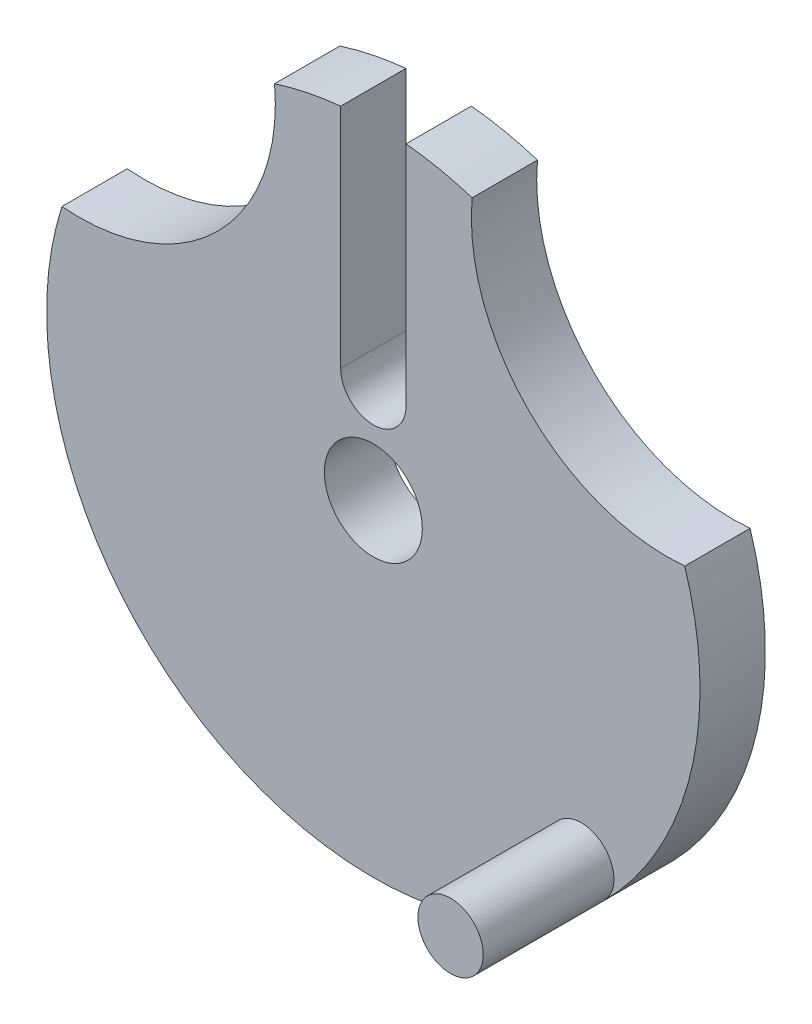
ISO-10303-21;
HEADER;
FILE_DESCRIPTION(('STEP AP214'),'2;1');
FILE_NAME('part.step','',(''),(''),'','','');
FILE_SCHEMA(('AUTOMOTIVE_DESIGN { 1 0 10303 214 1 1 1 1 }'));
ENDSEC;
DATA;
#1=APPLICATION_CONTEXT('core data for automotive mechanical design processes');
#2=APPLICATION_PROTOCOL_DEFINITION('international standard','automotive_design',2000,#1);
#3=PRODUCT_CONTEXT('',#1,'mechanical');
#4=PRODUCT('Part','Part','',(#3));
#5=PRODUCT_RELATED_PRODUCT_CATEGORY('part','',(#4));
#6=PRODUCT_DEFINITION_FORMATION('','',#4);
#7=PRODUCT_DEFINITION_CONTEXT('part definition',#1,'design');
#8=PRODUCT_DEFINITION('design','',#6,#7);
#9=PRODUCT_DEFINITION_SHAPE('','',#8);
#10=(LENGTH_UNIT() NAMED_UNIT(*) SI_UNIT(.MILLI.,.METRE.));
#11=(NAMED_UNIT(*) PLANE_ANGLE_UNIT() SI_UNIT($,.RADIAN.));
#12=(NAMED_UNIT(*) SI_UNIT($,.STERADIAN.) SOLID_ANGLE_UNIT());
#13=UNCERTAINTY_MEASURE_WITH_UNIT(LENGTH_MEASURE(1.E-05),#10,'distance_accuracy_value','');
#14=(GEOMETRIC_REPRESENTATION_CONTEXT(3) GLOBAL_UNCERTAINTY_ASSIGNED_CONTEXT((#13)) GLOBAL_UNIT_ASSIGNED_CONTEXT((#10,
#11,#12)) REPRESENTATION_CONTEXT('',''));
#15=CARTESIAN_POINT('',(0.,0.,0.));
#16=DIRECTION('',(0.,0.,1.));
#17=DIRECTION('',(1.,0.,0.));
#18=AXIS2_PLACEMENT_3D('',#15,#16,#17);
#19=CARTESIAN_POINT('',(0.,0.,5.));
#20=DIRECTION('',(0.,0.,-1.));
#21=DIRECTION('',(-1.,0.,0.));
#22=AXIS2_PLACEMENT_3D('',#19,#20,#21);
#23=CYLINDRICAL_SURFACE('',#22,25.);
#24=CARTESIAN_POINT('',(0.,0.,0.));
#25=DIRECTION('',(0.,0.,1.));
#26=DIRECTION('',(1.,0.,0.));
#27=AXIS2_PLACEMENT_3D('',#24,#25,#26);
#28=CIRCLE('',#27,25.);
#29=CARTESIAN_POINT('',(-23.8298248031153,7.55906408577356,0.));
#30=VERTEX_POINT('',#29);
#31=CARTESIAN_POINT('',(23.8298248031153,7.55906408577355,0.));
#32=VERTEX_POINT('',#31);
#33=EDGE_CURVE('E217',#30,#32,#28,.T.);
#34=ORIENTED_EDGE('',*,*,#33,.T.);
#35=DIRECTION('',(0.,0.,1.));
#36=VECTOR('',#35,1.);
#37=CARTESIAN_POINT('',(23.8298248031153,7.55906408577356,2.5));
#38=LINE('',#37,#36);
#39=CARTESIAN_POINT('',(23.8298248031153,7.55906408577356,5.));
#40=VERTEX_POINT('',#39);
#41=EDGE_CURVE('E50',#32,#40,#38,.T.);
#42=ORIENTED_EDGE('',*,*,#41,.T.);
#43=CARTESIAN_POINT('',(0.,0.,5.));
#44=DIRECTION('',(0.,0.,1.));
#45=DIRECTION('',(1.,0.,0.));
#46=AXIS2_PLACEMENT_3D('',#43,#44,#45);
#47=CIRCLE('',#46,25.);
#48=CARTESIAN_POINT('',(17.6776695296636,-17.6776695296638,5.));
#49=VERTEX_POINT('',#48);
#50=EDGE_CURVE('E43',#49,#40,#47,.T.);
#51=ORIENTED_EDGE('',*,*,#50,.F.);
#52=CARTESIAN_POINT('',(-23.8298248031153,7.55906408577356,5.));
#53=VERTEX_POINT('',#52);
#54=EDGE_CURVE('E42',#53,#49,#47,.T.);
#55=ORIENTED_EDGE('',*,*,#54,.F.);
#56=DIRECTION('',(0.,0.,1.));
#57=VECTOR('',#56,1.);
#58=CARTESIAN_POINT('',(-23.8298248031153,7.55906408577356,2.5));
#59=LINE('',#58,#57);
#60=EDGE_CURVE('E156',#53,#30,#59,.F.);
#61=ORIENTED_EDGE('',*,*,#60,.T.);
#62=EDGE_LOOP('',(#34,#42,#51,#55,#61));
#63=FACE_BOUND('',#62,.T.);
#64=ADVANCED_FACE('F33',(#63),#23,.T.);
#65=CARTESIAN_POINT('',(-2.5,24.8746859276655,0.));
#66=VERTEX_POINT('',#65);
#67=CARTESIAN_POINT('',(-7.55906408577363,23.8298248031153,0.));
#68=VERTEX_POINT('',#67);
#69=EDGE_CURVE('E37',#66,#68,#28,.T.);
#70=ORIENTED_EDGE('',*,*,#69,.T.);
#71=DIRECTION('',(0.,0.,1.));
#72=VECTOR('',#71,1.);
#73=CARTESIAN_POINT('',(-7.55906408577363,23.8298248031153,2.5));
#74=LINE('',#73,#72);
#75=CARTESIAN_POINT('',(-7.55906408577363,23.8298248031153,5.));
#76=VERTEX_POINT('',#75);
#77=EDGE_CURVE('E58',#68,#76,#74,.T.);
#78=ORIENTED_EDGE('',*,*,#77,.T.);
#79=CARTESIAN_POINT('',(-2.5,24.8746859276655,5.));
#80=VERTEX_POINT('',#79);
#81=EDGE_CURVE('E11',#80,#76,#47,.T.);
#82=ORIENTED_EDGE('',*,*,#81,.F.);
#83=DIRECTION('',(0.,0.,1.));
#84=VECTOR('',#83,1.);
#85=CARTESIAN_POINT('',(-2.5,24.8746859276655,0.));
#86=LINE('',#85,#84);
#87=EDGE_CURVE('E123',#66,#80,#86,.T.);
#88=ORIENTED_EDGE('',*,*,#87,.F.);
#89=EDGE_LOOP('',(#70,#78,#82,#88));
#90=FACE_BOUND('',#89,.T.);
#91=ADVANCED_FACE('F185',(#90),#23,.T.);
#92=CARTESIAN_POINT('',(7.55906408577363,23.8298248031153,5.));
#93=VERTEX_POINT('',#92);
#94=CARTESIAN_POINT('',(2.5,24.8746859276655,5.));
#95=VERTEX_POINT('',#94);
#96=EDGE_CURVE('E113',#93,#95,#47,.T.);
#97=ORIENTED_EDGE('',*,*,#96,.F.);
#98=DIRECTION('',(0.,0.,1.));
#99=VECTOR('',#98,1.);
#100=CARTESIAN_POINT('',(7.55906408577363,23.8298248031153,2.5));
#101=LINE('',#100,#99);
#102=CARTESIAN_POINT('',(7.55906408577363,23.8298248031153,0.));
#103=VERTEX_POINT('',#102);
#104=EDGE_CURVE('E152',#93,#103,#101,.F.);
#105=ORIENTED_EDGE('',*,*,#104,.T.);
#106=CARTESIAN_POINT('',(2.5,24.8746859276655,0.));
#107=VERTEX_POINT('',#106);
#108=EDGE_CURVE('E150',#103,#107,#28,.T.);
#109=ORIENTED_EDGE('',*,*,#108,.T.);
#110=DIRECTION('',(0.,0.,1.));
#111=VECTOR('',#110,1.);
#112=CARTESIAN_POINT('',(2.5,24.8746859276655,0.));
#113=LINE('',#112,#111);
#114=EDGE_CURVE('E119',#107,#95,#113,.T.);
#115=ORIENTED_EDGE('',*,*,#114,.T.);
#116=EDGE_LOOP('',(#97,#105,#109,#115));
#117=FACE_BOUND('',#116,.T.);
#118=ADVANCED_FACE('F35',(#117),#23,.T.);
#119=CARTESIAN_POINT('',(0.,0.,5.));
#120=DIRECTION('',(0.,0.,1.));
#121=DIRECTION('',(1.,0.,0.));
#122=AXIS2_PLACEMENT_3D('',#119,#120,#121);
#123=PLANE('',#122);
#124=ORIENTED_EDGE('',*,*,#54,.T.);
#125=CARTESIAN_POINT('',(15.9099025766972,-15.9099025766974,5.));
#126=DIRECTION('',(0.,0.,1.));
#127=DIRECTION('',(1.,0.,0.));
#128=AXIS2_PLACEMENT_3D('',#125,#126,#127);
#129=CIRCLE('',#128,2.5);
#130=EDGE_CURVE('E109',#49,#49,#129,.T.);
#131=ORIENTED_EDGE('',*,*,#130,.F.);
#132=ORIENTED_EDGE('',*,*,#50,.T.);
#133=CARTESIAN_POINT('',(22.5,22.4999999999999,5.));
#134=DIRECTION('',(0.,0.,1.));
#135=DIRECTION('',(1.,0.,0.));
#136=AXIS2_PLACEMENT_3D('',#133,#134,#135);
#137=CIRCLE('',#136,15.);
#138=EDGE_CURVE('E163',#93,#40,#137,.T.);
#139=ORIENTED_EDGE('',*,*,#138,.F.);
#140=ORIENTED_EDGE('',*,*,#96,.T.);
#141=DIRECTION('',(0.,1.,0.));
#142=VECTOR('',#141,1.);
#143=CARTESIAN_POINT('',(2.5,7.5,5.));
#144=LINE('',#143,#142);
#145=CARTESIAN_POINT('',(2.5,7.5,5.));
#146=VERTEX_POINT('',#145);
#147=EDGE_CURVE('E132',#146,#95,#144,.T.);
#148=ORIENTED_EDGE('',*,*,#147,.F.);
#149=CARTESIAN_POINT('',(0.,7.5,5.));
#150=DIRECTION('',(0.,0.,1.));
#151=DIRECTION('',(1.,0.,0.));
#152=AXIS2_PLACEMENT_3D('',#149,#150,#151);
#153=CIRCLE('',#152,2.5);
#154=CARTESIAN_POINT('',(-2.5,7.5,5.));
#155=VERTEX_POINT('',#154);
#156=EDGE_CURVE('E135',#155,#146,#153,.T.);
#157=ORIENTED_EDGE('',*,*,#156,.F.);
#158=DIRECTION('',(0.,-1.,0.));
#159=VECTOR('',#158,1.);
#160=CARTESIAN_POINT('',(-2.5,7.5,5.));
#161=LINE('',#160,#159);
#162=EDGE_CURVE('E128',#80,#155,#161,.T.);
#163=ORIENTED_EDGE('',*,*,#162,.F.);
#164=ORIENTED_EDGE('',*,*,#81,.T.);
#165=CARTESIAN_POINT('',(-22.5,22.4999999999999,5.));
#166=DIRECTION('',(0.,0.,1.));
#167=DIRECTION('',(-1.,0.,0.));
#168=AXIS2_PLACEMENT_3D('',#165,#166,#167);
#169=CIRCLE('',#168,15.);
#170=EDGE_CURVE('E110',#53,#76,#169,.T.);
#171=ORIENTED_EDGE('',*,*,#170,.F.);
#172=EDGE_LOOP('',(#124,#131,#132,#139,#140,#148,#157,#163,#164,#171));
#173=FACE_BOUND('',#172,.T.);
#174=CARTESIAN_POINT('',(0.,0.,5.));
#175=DIRECTION('',(0.,0.,1.));
#176=DIRECTION('',(1.,0.,0.));
#177=AXIS2_PLACEMENT_3D('',#174,#175,#176);
#178=CIRCLE('',#177,3.75);
#179=CARTESIAN_POINT('',(3.75,0.,5.));
#180=VERTEX_POINT('',#179);
#181=EDGE_CURVE('E127',#180,#180,#178,.T.);
#182=ORIENTED_EDGE('',*,*,#181,.F.);
#183=EDGE_LOOP('',(#182));
#184=FACE_BOUND('',#183,.T.);
#185=ADVANCED_FACE('F106',(#173,#184),#123,.T.);
#186=CARTESIAN_POINT('',(0.,0.,0.));
#187=DIRECTION('',(0.,0.,1.));
#188=DIRECTION('',(1.,0.,0.));
#189=AXIS2_PLACEMENT_3D('',#186,#187,#188);
#190=PLANE('',#189);
#191=CARTESIAN_POINT('',(0.,0.,0.));
#192=DIRECTION('',(0.,0.,1.));
#193=DIRECTION('',(1.,0.,0.));
#194=AXIS2_PLACEMENT_3D('',#191,#192,#193);
#195=CIRCLE('',#194,3.75);
#196=CARTESIAN_POINT('',(3.75,0.,0.));
#197=VERTEX_POINT('',#196);
#198=EDGE_CURVE('E147',#197,#197,#195,.T.);
#199=ORIENTED_EDGE('',*,*,#198,.T.);
#200=EDGE_LOOP('',(#199));
#201=FACE_BOUND('',#200,.T.);
#202=ORIENTED_EDGE('',*,*,#108,.F.);
#203=CARTESIAN_POINT('',(22.5,22.4999999999999,0.));
#204=DIRECTION('',(0.,0.,1.));
#205=DIRECTION('',(1.,0.,0.));
#206=AXIS2_PLACEMENT_3D('',#203,#204,#205);
#207=CIRCLE('',#206,15.);
#208=EDGE_CURVE('E158',#103,#32,#207,.T.);
#209=ORIENTED_EDGE('',*,*,#208,.T.);
#210=ORIENTED_EDGE('',*,*,#33,.F.);
#211=CARTESIAN_POINT('',(-22.5,22.4999999999999,0.));
#212=DIRECTION('',(0.,0.,1.));
#213=DIRECTION('',(-1.,0.,0.));
#214=AXIS2_PLACEMENT_3D('',#211,#212,#213);
#215=CIRCLE('',#214,15.);
#216=EDGE_CURVE('E160',#30,#68,#215,.T.);
#217=ORIENTED_EDGE('',*,*,#216,.T.);
#218=ORIENTED_EDGE('',*,*,#69,.F.);
#219=DIRECTION('',(0.,-1.,0.));
#220=VECTOR('',#219,1.);
#221=CARTESIAN_POINT('',(-2.5,7.5,0.));
#222=LINE('',#221,#220);
#223=CARTESIAN_POINT('',(-2.5,7.5,0.));
#224=VERTEX_POINT('',#223);
#225=EDGE_CURVE('E120',#66,#224,#222,.T.);
#226=ORIENTED_EDGE('',*,*,#225,.T.);
#227=CARTESIAN_POINT('',(0.,7.5,0.));
#228=DIRECTION('',(0.,0.,1.));
#229=DIRECTION('',(1.,0.,0.));
#230=AXIS2_PLACEMENT_3D('',#227,#228,#229);
#231=CIRCLE('',#230,2.5);
#232=CARTESIAN_POINT('',(2.5,7.5,0.));
#233=VERTEX_POINT('',#232);
#234=EDGE_CURVE('E131',#224,#233,#231,.T.);
#235=ORIENTED_EDGE('',*,*,#234,.T.);
#236=DIRECTION('',(0.,1.,0.));
#237=VECTOR('',#236,1.);
#238=CARTESIAN_POINT('',(2.5,7.5,0.));
#239=LINE('',#238,#237);
#240=EDGE_CURVE('E140',#233,#107,#239,.T.);
#241=ORIENTED_EDGE('',*,*,#240,.T.);
#242=EDGE_LOOP('',(#202,#209,#210,#217,#218,#226,#235,#241));
#243=FACE_BOUND('',#242,.T.);
#244=ADVANCED_FACE('F197',(#201,#243),#190,.F.);
#245=CARTESIAN_POINT('',(0.,7.5,0.));
#246=DIRECTION('',(0.,0.,1.));
#247=DIRECTION('',(1.,0.,0.));
#248=AXIS2_PLACEMENT_3D('',#245,#246,#247);
#249=CYLINDRICAL_SURFACE('',#248,2.5);
#250=ORIENTED_EDGE('',*,*,#156,.T.);
#251=DIRECTION('',(0.,0.,1.));
#252=VECTOR('',#251,1.);
#253=CARTESIAN_POINT('',(2.5,7.5,0.));
#254=LINE('',#253,#252);
#255=EDGE_CURVE('E117',#233,#146,#254,.T.);
#256=ORIENTED_EDGE('',*,*,#255,.F.);
#257=ORIENTED_EDGE('',*,*,#234,.F.);
#258=DIRECTION('',(0.,0.,1.));
#259=VECTOR('',#258,1.);
#260=CARTESIAN_POINT('',(-2.5,7.5,0.));
#261=LINE('',#260,#259);
#262=EDGE_CURVE('E125',#224,#155,#261,.T.);
#263=ORIENTED_EDGE('',*,*,#262,.T.);
#264=EDGE_LOOP('',(#250,#256,#257,#263));
#265=FACE_BOUND('',#264,.T.);
#266=ADVANCED_FACE('F209',(#265),#249,.F.);
#267=CARTESIAN_POINT('',(-2.5,7.5,0.));
#268=DIRECTION('',(-1.,0.,0.));
#269=DIRECTION('',(0.,0.,1.));
#270=AXIS2_PLACEMENT_3D('',#267,#268,#269);
#271=PLANE('',#270);
#272=ORIENTED_EDGE('',*,*,#162,.T.);
#273=ORIENTED_EDGE('',*,*,#262,.F.);
#274=ORIENTED_EDGE('',*,*,#225,.F.);
#275=ORIENTED_EDGE('',*,*,#87,.T.);
#276=EDGE_LOOP('',(#272,#273,#274,#275));
#277=FACE_BOUND('',#276,.T.);
#278=ADVANCED_FACE('F219',(#277),#271,.F.);
#279=CARTESIAN_POINT('',(2.5,7.5,0.));
#280=DIRECTION('',(1.,0.,0.));
#281=DIRECTION('',(0.,0.,-1.));
#282=AXIS2_PLACEMENT_3D('',#279,#280,#281);
#283=PLANE('',#282);
#284=ORIENTED_EDGE('',*,*,#147,.T.);
#285=ORIENTED_EDGE('',*,*,#114,.F.);
#286=ORIENTED_EDGE('',*,*,#240,.F.);
#287=ORIENTED_EDGE('',*,*,#255,.T.);
#288=EDGE_LOOP('',(#284,#285,#286,#287));
#289=FACE_BOUND('',#288,.T.);
#290=ADVANCED_FACE('F205',(#289),#283,.F.);
#291=CARTESIAN_POINT('',(0.,0.,0.));
#292=DIRECTION('',(0.,0.,1.));
#293=DIRECTION('',(1.,0.,0.));
#294=AXIS2_PLACEMENT_3D('',#291,#292,#293);
#295=CYLINDRICAL_SURFACE('',#294,3.75);
#296=ORIENTED_EDGE('',*,*,#198,.F.);
#297=EDGE_LOOP('',(#296));
#298=FACE_BOUND('',#297,.T.);
#299=ORIENTED_EDGE('',*,*,#181,.T.);
#300=EDGE_LOOP('',(#299));
#301=FACE_BOUND('',#300,.T.);
#302=ADVANCED_FACE('F226',(#298,#301),#295,.F.);
#303=CARTESIAN_POINT('',(-22.5,22.4999999999999,0.));
#304=DIRECTION('',(0.,0.,1.));
#305=DIRECTION('',(1.,0.,0.));
#306=AXIS2_PLACEMENT_3D('',#303,#304,#305);
#307=CYLINDRICAL_SURFACE('',#306,15.);
#308=ORIENTED_EDGE('',*,*,#216,.F.);
#309=ORIENTED_EDGE('',*,*,#60,.F.);
#310=ORIENTED_EDGE('',*,*,#170,.T.);
#311=ORIENTED_EDGE('',*,*,#77,.F.);
#312=EDGE_LOOP('',(#308,#309,#310,#311));
#313=FACE_BOUND('',#312,.T.);
#314=ADVANCED_FACE('F182',(#313),#307,.F.);
#315=CARTESIAN_POINT('',(22.5,22.4999999999999,0.));
#316=DIRECTION('',(0.,0.,1.));
#317=DIRECTION('',(1.,0.,0.));
#318=AXIS2_PLACEMENT_3D('',#315,#316,#317);
#319=CYLINDRICAL_SURFACE('',#318,15.);
#320=ORIENTED_EDGE('',*,*,#208,.F.);
#321=ORIENTED_EDGE('',*,*,#104,.F.);
#322=ORIENTED_EDGE('',*,*,#138,.T.);
#323=ORIENTED_EDGE('',*,*,#41,.F.);
#324=EDGE_LOOP('',(#320,#321,#322,#323));
#325=FACE_BOUND('',#324,.T.);
#326=ADVANCED_FACE('F175',(#325),#319,.F.);
#327=CARTESIAN_POINT('',(15.9099025766972,-15.9099025766974,15.));
#328=DIRECTION('',(0.,0.,-1.));
#329=DIRECTION('',(-1.,0.,0.));
#330=AXIS2_PLACEMENT_3D('',#327,#328,#329);
#331=CYLINDRICAL_SURFACE('',#330,2.5);
#332=CARTESIAN_POINT('',(15.9099025766972,-15.9099025766974,15.));
#333=DIRECTION('',(0.,0.,1.));
#334=DIRECTION('',(1.,0.,0.));
#335=AXIS2_PLACEMENT_3D('',#332,#333,#334);
#336=CIRCLE('',#335,2.5);
#337=CARTESIAN_POINT('',(18.4099025766972,-15.9099025766974,15.));
#338=VERTEX_POINT('',#337);
#339=EDGE_CURVE('E161',#338,#338,#336,.T.);
#340=ORIENTED_EDGE('',*,*,#339,.F.);
#341=EDGE_LOOP('',(#340));
#342=FACE_BOUND('',#341,.T.);
#343=ORIENTED_EDGE('',*,*,#130,.T.);
#344=EDGE_LOOP('',(#343));
#345=FACE_BOUND('',#344,.T.);
#346=ADVANCED_FACE('F172',(#342,#345),#331,.T.);
#347=CARTESIAN_POINT('',(15.9099025766972,-15.9099025766974,15.));
#348=DIRECTION('',(0.,0.,1.));
#349=DIRECTION('',(1.,0.,0.));
#350=AXIS2_PLACEMENT_3D('',#347,#348,#349);
#351=PLANE('',#350);
#352=ORIENTED_EDGE('',*,*,#339,.T.);
#353=EDGE_LOOP('',(#352));
#354=FACE_BOUND('',#353,.T.);
#355=ADVANCED_FACE('F170',(#354),#351,.T.);
#356=CLOSED_SHELL('',(#64,#91,#118,#185,#244,#266,#278,#290,#302,#314,#326,#346,#355));
#357=MANIFOLD_SOLID_BREP('B2',#356);
#358=ADVANCED_BREP_SHAPE_REPRESENTATION('',(#18,#357),#14);
#359=SHAPE_DEFINITION_REPRESENTATION(#9,#358);
ENDSEC;
END-ISO-10303-21;
